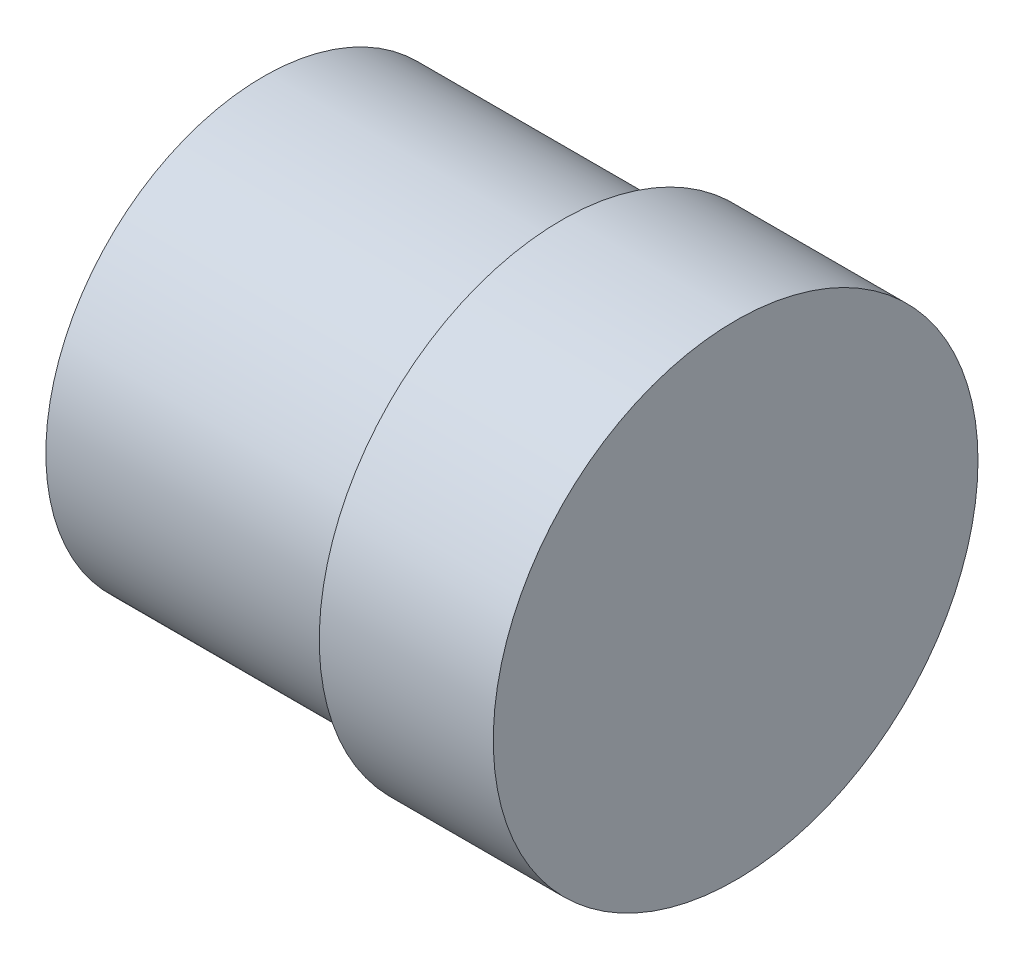
ISO-10303-21;
HEADER;
FILE_DESCRIPTION(('STEP AP214'),'2;1');
FILE_NAME('part.step','',(''),(''),'','','');
FILE_SCHEMA(('AUTOMOTIVE_DESIGN { 1 0 10303 214 1 1 1 1 }'));
ENDSEC;
DATA;
#1=APPLICATION_CONTEXT('core data for automotive mechanical design processes');
#2=APPLICATION_PROTOCOL_DEFINITION('international standard','automotive_design',2000,#1);
#3=PRODUCT_CONTEXT('',#1,'mechanical');
#4=PRODUCT('Part','Part','',(#3));
#5=PRODUCT_RELATED_PRODUCT_CATEGORY('part','',(#4));
#6=PRODUCT_DEFINITION_FORMATION('','',#4);
#7=PRODUCT_DEFINITION_CONTEXT('part definition',#1,'design');
#8=PRODUCT_DEFINITION('design','',#6,#7);
#9=PRODUCT_DEFINITION_SHAPE('','',#8);
#10=(LENGTH_UNIT() NAMED_UNIT(*) SI_UNIT(.MILLI.,.METRE.));
#11=(NAMED_UNIT(*) PLANE_ANGLE_UNIT() SI_UNIT($,.RADIAN.));
#12=(NAMED_UNIT(*) SI_UNIT($,.STERADIAN.) SOLID_ANGLE_UNIT());
#13=UNCERTAINTY_MEASURE_WITH_UNIT(LENGTH_MEASURE(1.E-05),#10,'distance_accuracy_value','');
#14=(GEOMETRIC_REPRESENTATION_CONTEXT(3) GLOBAL_UNCERTAINTY_ASSIGNED_CONTEXT((#13)) GLOBAL_UNIT_ASSIGNED_CONTEXT((#10,
#11,#12)) REPRESENTATION_CONTEXT('',''));
#15=CARTESIAN_POINT('',(0.,0.,0.));
#16=DIRECTION('',(0.,0.,1.));
#17=DIRECTION('',(1.,0.,0.));
#18=AXIS2_PLACEMENT_3D('',#15,#16,#17);
#19=CARTESIAN_POINT('',(355.6,0.,0.));
#20=DIRECTION('',(-1.,0.,0.));
#21=DIRECTION('',(0.,0.,1.));
#22=AXIS2_PLACEMENT_3D('',#19,#20,#21);
#23=CYLINDRICAL_SURFACE('',#22,495.3);
#24=CARTESIAN_POINT('',(355.6,0.,0.));
#25=DIRECTION('',(1.,0.,0.));
#26=DIRECTION('',(0.,0.,-1.));
#27=AXIS2_PLACEMENT_3D('',#24,#25,#26);
#28=CIRCLE('',#27,495.3);
#29=CARTESIAN_POINT('',(355.6,0.,-495.3));
#30=VERTEX_POINT('',#29);
#31=EDGE_CURVE('E10',#30,#30,#28,.T.);
#32=ORIENTED_EDGE('',*,*,#31,.F.);
#33=EDGE_LOOP('',(#32));
#34=FACE_BOUND('',#33,.T.);
#35=CARTESIAN_POINT('',(0.,0.,0.));
#36=DIRECTION('',(1.,0.,0.));
#37=DIRECTION('',(0.,0.,-1.));
#38=AXIS2_PLACEMENT_3D('',#35,#36,#37);
#39=CIRCLE('',#38,495.3);
#40=CARTESIAN_POINT('',(0.,0.,-495.3));
#41=VERTEX_POINT('',#40);
#42=EDGE_CURVE('E34',#41,#41,#39,.T.);
#43=ORIENTED_EDGE('',*,*,#42,.T.);
#44=EDGE_LOOP('',(#43));
#45=FACE_BOUND('',#44,.T.);
#46=ADVANCED_FACE('F31',(#34,#45),#23,.T.);
#47=CARTESIAN_POINT('',(355.6,0.,0.));
#48=DIRECTION('',(1.,0.,0.));
#49=DIRECTION('',(0.,0.,-1.));
#50=AXIS2_PLACEMENT_3D('',#47,#48,#49);
#51=PLANE('',#50);
#52=ORIENTED_EDGE('',*,*,#31,.T.);
#53=EDGE_LOOP('',(#52));
#54=FACE_BOUND('',#53,.T.);
#55=ADVANCED_FACE('F61',(#54),#51,.T.);
#56=CARTESIAN_POINT('',(0.,0.,0.));
#57=DIRECTION('',(1.,0.,0.));
#58=DIRECTION('',(0.,0.,-1.));
#59=AXIS2_PLACEMENT_3D('',#56,#57,#58);
#60=PLANE('',#59);
#61=CARTESIAN_POINT('',(0.,0.,0.));
#62=DIRECTION('',(1.,0.,0.));
#63=DIRECTION('',(0.,0.,-1.));
#64=AXIS2_PLACEMENT_3D('',#61,#62,#63);
#65=CIRCLE('',#64,444.5);
#66=CARTESIAN_POINT('',(0.,0.,-444.5));
#67=VERTEX_POINT('',#66);
#68=EDGE_CURVE('E43',#67,#67,#65,.T.);
#69=ORIENTED_EDGE('',*,*,#68,.T.);
#70=EDGE_LOOP('',(#69));
#71=FACE_BOUND('',#70,.T.);
#72=ORIENTED_EDGE('',*,*,#42,.F.);
#73=EDGE_LOOP('',(#72));
#74=FACE_BOUND('',#73,.T.);
#75=ADVANCED_FACE('F58',(#71,#74),#60,.F.);
#76=CARTESIAN_POINT('',(-609.6,0.,0.));
#77=DIRECTION('',(1.,0.,0.));
#78=DIRECTION('',(0.,0.,-1.));
#79=AXIS2_PLACEMENT_3D('',#76,#77,#78);
#80=CYLINDRICAL_SURFACE('',#79,444.5);
#81=CARTESIAN_POINT('',(-609.6,0.,0.));
#82=DIRECTION('',(1.,0.,0.));
#83=DIRECTION('',(0.,0.,-1.));
#84=AXIS2_PLACEMENT_3D('',#81,#82,#83);
#85=CIRCLE('',#84,444.5);
#86=CARTESIAN_POINT('',(-609.6,0.,-444.5));
#87=VERTEX_POINT('',#86);
#88=EDGE_CURVE('E41',#87,#87,#85,.T.);
#89=CARTESIAN_POINT('',(-609.6,0.,-444.5));
#90=CARTESIAN_POINT('',(-603.25,0.,-444.5));
#91=CARTESIAN_POINT('',(-596.9,0.,-444.5));
#92=CARTESIAN_POINT('',(-584.2,0.,-444.5));
#93=CARTESIAN_POINT('',(-577.85,0.,-444.5));
#94=CARTESIAN_POINT('',(-565.15,0.,-444.5));
#95=CARTESIAN_POINT('',(-558.8,0.,-444.5));
#96=CARTESIAN_POINT('',(-546.1,0.,-444.5));
#97=CARTESIAN_POINT('',(-539.75,0.,-444.5));
#98=CARTESIAN_POINT('',(-527.05,0.,-444.5));
#99=CARTESIAN_POINT('',(-520.7,0.,-444.5));
#100=CARTESIAN_POINT('',(-508.,0.,-444.5));
#101=CARTESIAN_POINT('',(-501.65,0.,-444.5));
#102=CARTESIAN_POINT('',(-488.95,0.,-444.5));
#103=CARTESIAN_POINT('',(-482.6,0.,-444.5));
#104=CARTESIAN_POINT('',(-469.9,0.,-444.5));
#105=CARTESIAN_POINT('',(-463.55,0.,-444.5));
#106=CARTESIAN_POINT('',(-450.85,0.,-444.5));
#107=CARTESIAN_POINT('',(-444.5,0.,-444.5));
#108=CARTESIAN_POINT('',(-431.8,0.,-444.5));
#109=CARTESIAN_POINT('',(-425.45,0.,-444.5));
#110=CARTESIAN_POINT('',(-412.75,0.,-444.5));
#111=CARTESIAN_POINT('',(-406.4,0.,-444.5));
#112=CARTESIAN_POINT('',(-393.7,0.,-444.5));
#113=CARTESIAN_POINT('',(-387.35,0.,-444.5));
#114=CARTESIAN_POINT('',(-374.65,0.,-444.5));
#115=CARTESIAN_POINT('',(-368.3,0.,-444.5));
#116=CARTESIAN_POINT('',(-355.6,0.,-444.5));
#117=CARTESIAN_POINT('',(-349.25,0.,-444.5));
#118=CARTESIAN_POINT('',(-336.55,0.,-444.5));
#119=CARTESIAN_POINT('',(-330.2,0.,-444.5));
#120=CARTESIAN_POINT('',(-317.5,0.,-444.5));
#121=CARTESIAN_POINT('',(-311.15,0.,-444.5));
#122=CARTESIAN_POINT('',(-298.45,0.,-444.5));
#123=CARTESIAN_POINT('',(-292.1,0.,-444.5));
#124=CARTESIAN_POINT('',(-279.4,0.,-444.5));
#125=CARTESIAN_POINT('',(-273.05,0.,-444.5));
#126=CARTESIAN_POINT('',(-260.35,0.,-444.5));
#127=CARTESIAN_POINT('',(-254.,0.,-444.5));
#128=CARTESIAN_POINT('',(-241.3,0.,-444.5));
#129=CARTESIAN_POINT('',(-234.95,0.,-444.5));
#130=CARTESIAN_POINT('',(-222.25,0.,-444.5));
#131=CARTESIAN_POINT('',(-215.9,0.,-444.5));
#132=CARTESIAN_POINT('',(-203.2,0.,-444.5));
#133=CARTESIAN_POINT('',(-196.85,0.,-444.5));
#134=CARTESIAN_POINT('',(-184.15,0.,-444.5));
#135=CARTESIAN_POINT('',(-177.8,0.,-444.5));
#136=CARTESIAN_POINT('',(-165.1,0.,-444.5));
#137=CARTESIAN_POINT('',(-158.75,0.,-444.5));
#138=CARTESIAN_POINT('',(-146.05,0.,-444.5));
#139=CARTESIAN_POINT('',(-139.7,0.,-444.5));
#140=CARTESIAN_POINT('',(-127.,0.,-444.5));
#141=CARTESIAN_POINT('',(-120.65,0.,-444.5));
#142=CARTESIAN_POINT('',(-107.95,0.,-444.5));
#143=CARTESIAN_POINT('',(-101.6,0.,-444.5));
#144=CARTESIAN_POINT('',(-88.9,0.,-444.5));
#145=CARTESIAN_POINT('',(-82.5500000000001,0.,-444.5));
#146=CARTESIAN_POINT('',(-69.85,0.,-444.5));
#147=CARTESIAN_POINT('',(-63.5,0.,-444.5));
#148=CARTESIAN_POINT('',(-50.8,0.,-444.5));
#149=CARTESIAN_POINT('',(-44.45,0.,-444.5));
#150=CARTESIAN_POINT('',(-31.75,0.,-444.5));
#151=CARTESIAN_POINT('',(-25.4,0.,-444.5));
#152=CARTESIAN_POINT('',(-12.7,0.,-444.5));
#153=CARTESIAN_POINT('',(-6.35000000000001,0.,-444.5));
#154=CARTESIAN_POINT('',(0.,0.,-444.5));
#155=B_SPLINE_CURVE_WITH_KNOTS('',3,(#89,#90,#91,#92,#93,#94,#95,#96,#97,#98,#99,#100,#101,#102,
#103,#104,#105,#106,#107,#108,#109,#110,#111,#112,#113,#114,#115,#116,#117,#118,#119,#120,#121,
#122,#123,#124,#125,#126,#127,#128,#129,#130,#131,#132,#133,#134,#135,#136,#137,#138,#139,#140,
#141,#142,#143,#144,#145,#146,#147,#148,#149,#150,#151,#152,#153,#154),.UNSPECIFIED.,.F.,.F.,(4,
2,2,2,2,2,2,2,2,2,2,2,2,2,2,2,2,2,2,2,2,2,2,2,2,2,2,2,2,2,2,2,4),(0.,19.05,38.1,57.15,76.2,
95.2500000000001,114.3,133.35,152.4,171.45,190.5,209.55,228.6,247.65,266.7,285.75,304.8,323.85,
342.9,361.95,381.,400.05,419.1,438.15,457.2,476.25,495.3,514.35,533.4,552.45,571.5,590.55,
609.6),.UNSPECIFIED.);
#156=EDGE_CURVE('BSEAM49',#87,#67,#155,.T.);
#157=ORIENTED_EDGE('',*,*,#88,.T.);
#158=ORIENTED_EDGE('',*,*,#68,.F.);
#159=ORIENTED_EDGE('',*,*,#156,.T.);
#160=ORIENTED_EDGE('',*,*,#156,.F.);
#161=EDGE_LOOP('',(#157,#159,#158,#160));
#162=FACE_BOUND('',#161,.T.);
#163=ADVANCED_FACE('F49',(#162),#80,.T.);
#164=CARTESIAN_POINT('',(-609.6,0.,0.));
#165=DIRECTION('',(1.,0.,0.));
#166=DIRECTION('',(0.,0.,-1.));
#167=AXIS2_PLACEMENT_3D('',#164,#165,#166);
#168=PLANE('',#167);
#169=ORIENTED_EDGE('',*,*,#88,.F.);
#170=EDGE_LOOP('',(#169));
#171=FACE_BOUND('',#170,.T.);
#172=ADVANCED_FACE('F52',(#171),#168,.F.);
#173=CLOSED_SHELL('',(#46,#55,#75,#163,#172));
#174=MANIFOLD_SOLID_BREP('B2',#173);
#175=ADVANCED_BREP_SHAPE_REPRESENTATION('',(#18,#174),#14);
#176=SHAPE_DEFINITION_REPRESENTATION(#9,#175);
ENDSEC;
END-ISO-10303-21;
